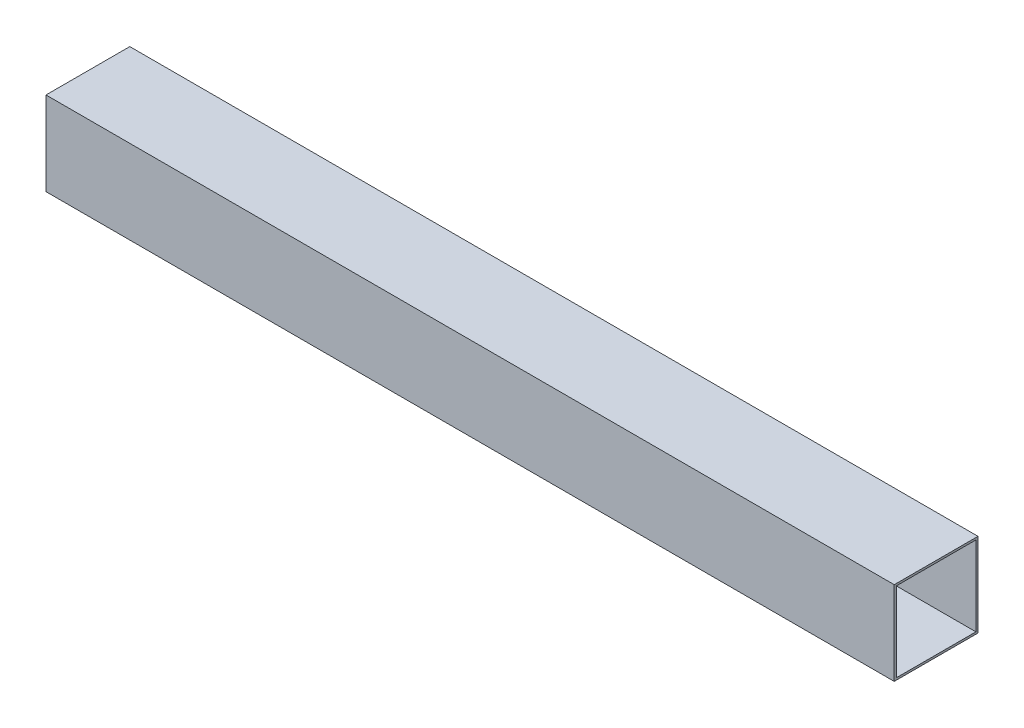
ISO-10303-21;
HEADER;
FILE_DESCRIPTION(('STEP AP214'),'2;1');
FILE_NAME('part.step','',(''),(''),'','','');
FILE_SCHEMA(('AUTOMOTIVE_DESIGN { 1 0 10303 214 1 1 1 1 }'));
ENDSEC;
DATA;
#1=APPLICATION_CONTEXT('core data for automotive mechanical design processes');
#2=APPLICATION_PROTOCOL_DEFINITION('international standard','automotive_design',2000,#1);
#3=PRODUCT_CONTEXT('',#1,'mechanical');
#4=PRODUCT('Part','Part','',(#3));
#5=PRODUCT_RELATED_PRODUCT_CATEGORY('part','',(#4));
#6=PRODUCT_DEFINITION_FORMATION('','',#4);
#7=PRODUCT_DEFINITION_CONTEXT('part definition',#1,'design');
#8=PRODUCT_DEFINITION('design','',#6,#7);
#9=PRODUCT_DEFINITION_SHAPE('','',#8);
#10=(LENGTH_UNIT() NAMED_UNIT(*) SI_UNIT(.MILLI.,.METRE.));
#11=(NAMED_UNIT(*) PLANE_ANGLE_UNIT() SI_UNIT($,.RADIAN.));
#12=(NAMED_UNIT(*) SI_UNIT($,.STERADIAN.) SOLID_ANGLE_UNIT());
#13=UNCERTAINTY_MEASURE_WITH_UNIT(LENGTH_MEASURE(1.E-05),#10,'distance_accuracy_value','');
#14=(GEOMETRIC_REPRESENTATION_CONTEXT(3) GLOBAL_UNCERTAINTY_ASSIGNED_CONTEXT((#13)) GLOBAL_UNIT_ASSIGNED_CONTEXT((#10,
#11,#12)) REPRESENTATION_CONTEXT('',''));
#15=CARTESIAN_POINT('',(0.,0.,0.));
#16=DIRECTION('',(0.,0.,1.));
#17=DIRECTION('',(1.,0.,0.));
#18=AXIS2_PLACEMENT_3D('',#15,#16,#17);
#19=CARTESIAN_POINT('',(405.,0.,0.));
#20=DIRECTION('',(1.,0.,0.));
#21=DIRECTION('',(0.,0.,-1.));
#22=AXIS2_PLACEMENT_3D('',#19,#20,#21);
#23=PLANE('',#22);
#24=DIRECTION('',(0.,-1.,0.));
#25=VECTOR('',#24,1.);
#26=CARTESIAN_POINT('',(405.,40.,40.));
#27=LINE('',#26,#25);
#28=CARTESIAN_POINT('',(405.,40.,40.));
#29=VERTEX_POINT('',#28);
#30=CARTESIAN_POINT('',(405.,-40.,40.));
#31=VERTEX_POINT('',#30);
#32=EDGE_CURVE('E136',#29,#31,#27,.T.);
#33=ORIENTED_EDGE('',*,*,#32,.T.);
#34=DIRECTION('',(0.,0.,-1.));
#35=VECTOR('',#34,1.);
#36=CARTESIAN_POINT('',(405.,-40.,40.));
#37=LINE('',#36,#35);
#38=CARTESIAN_POINT('',(405.,-40.,-40.));
#39=VERTEX_POINT('',#38);
#40=EDGE_CURVE('E139',#31,#39,#37,.T.);
#41=ORIENTED_EDGE('',*,*,#40,.T.);
#42=DIRECTION('',(0.,1.,0.));
#43=VECTOR('',#42,1.);
#44=CARTESIAN_POINT('',(405.,40.,-40.));
#45=LINE('',#44,#43);
#46=CARTESIAN_POINT('',(405.,40.,-40.));
#47=VERTEX_POINT('',#46);
#48=EDGE_CURVE('E142',#39,#47,#45,.T.);
#49=ORIENTED_EDGE('',*,*,#48,.T.);
#50=DIRECTION('',(0.,0.,1.));
#51=VECTOR('',#50,1.);
#52=CARTESIAN_POINT('',(405.,40.,40.));
#53=LINE('',#52,#51);
#54=EDGE_CURVE('E144',#47,#29,#53,.T.);
#55=ORIENTED_EDGE('',*,*,#54,.T.);
#56=EDGE_LOOP('',(#33,#41,#49,#55));
#57=FACE_BOUND('',#56,.T.);
#58=DIRECTION('',(0.,-1.,0.));
#59=VECTOR('',#58,1.);
#60=CARTESIAN_POINT('',(405.,38.,38.));
#61=LINE('',#60,#59);
#62=CARTESIAN_POINT('',(405.,38.,38.));
#63=VERTEX_POINT('',#62);
#64=CARTESIAN_POINT('',(405.,-38.,38.));
#65=VERTEX_POINT('',#64);
#66=EDGE_CURVE('E108',#63,#65,#61,.T.);
#67=ORIENTED_EDGE('',*,*,#66,.F.);
#68=DIRECTION('',(0.,0.,1.));
#69=VECTOR('',#68,1.);
#70=CARTESIAN_POINT('',(405.,38.,38.));
#71=LINE('',#70,#69);
#72=CARTESIAN_POINT('',(405.,38.,-38.));
#73=VERTEX_POINT('',#72);
#74=EDGE_CURVE('E100',#73,#63,#71,.T.);
#75=ORIENTED_EDGE('',*,*,#74,.F.);
#76=DIRECTION('',(0.,1.,0.));
#77=VECTOR('',#76,1.);
#78=CARTESIAN_POINT('',(405.,38.,-38.));
#79=LINE('',#78,#77);
#80=CARTESIAN_POINT('',(405.,-38.,-38.));
#81=VERTEX_POINT('',#80);
#82=EDGE_CURVE('E122',#81,#73,#79,.T.);
#83=ORIENTED_EDGE('',*,*,#82,.F.);
#84=DIRECTION('',(0.,0.,-1.));
#85=VECTOR('',#84,1.);
#86=CARTESIAN_POINT('',(405.,-38.,38.));
#87=LINE('',#86,#85);
#88=EDGE_CURVE('E120',#65,#81,#87,.T.);
#89=ORIENTED_EDGE('',*,*,#88,.F.);
#90=EDGE_LOOP('',(#67,#75,#83,#89));
#91=FACE_BOUND('',#90,.T.);
#92=ADVANCED_FACE('F35',(#57,#91),#23,.T.);
#93=CARTESIAN_POINT('',(-405.,0.,0.));
#94=DIRECTION('',(1.,0.,0.));
#95=DIRECTION('',(0.,0.,-1.));
#96=AXIS2_PLACEMENT_3D('',#93,#94,#95);
#97=PLANE('',#96);
#98=DIRECTION('',(0.,-1.,0.));
#99=VECTOR('',#98,1.);
#100=CARTESIAN_POINT('',(-405.,40.,40.));
#101=LINE('',#100,#99);
#102=CARTESIAN_POINT('',(-405.,40.,40.));
#103=VERTEX_POINT('',#102);
#104=CARTESIAN_POINT('',(-405.,-40.,40.));
#105=VERTEX_POINT('',#104);
#106=EDGE_CURVE('E116',#103,#105,#101,.T.);
#107=ORIENTED_EDGE('',*,*,#106,.F.);
#108=DIRECTION('',(0.,0.,1.));
#109=VECTOR('',#108,1.);
#110=CARTESIAN_POINT('',(-405.,40.,40.));
#111=LINE('',#110,#109);
#112=CARTESIAN_POINT('',(-405.,40.,-40.));
#113=VERTEX_POINT('',#112);
#114=EDGE_CURVE('E140',#113,#103,#111,.T.);
#115=ORIENTED_EDGE('',*,*,#114,.F.);
#116=DIRECTION('',(0.,1.,0.));
#117=VECTOR('',#116,1.);
#118=CARTESIAN_POINT('',(-405.,40.,-40.));
#119=LINE('',#118,#117);
#120=CARTESIAN_POINT('',(-405.,-40.,-40.));
#121=VERTEX_POINT('',#120);
#122=EDGE_CURVE('E151',#121,#113,#119,.T.);
#123=ORIENTED_EDGE('',*,*,#122,.F.);
#124=DIRECTION('',(0.,0.,-1.));
#125=VECTOR('',#124,1.);
#126=CARTESIAN_POINT('',(-405.,-40.,40.));
#127=LINE('',#126,#125);
#128=EDGE_CURVE('E149',#105,#121,#127,.T.);
#129=ORIENTED_EDGE('',*,*,#128,.F.);
#130=EDGE_LOOP('',(#107,#115,#123,#129));
#131=FACE_BOUND('',#130,.T.);
#132=DIRECTION('',(0.,0.,1.));
#133=VECTOR('',#132,1.);
#134=CARTESIAN_POINT('',(-405.,38.,38.));
#135=LINE('',#134,#133);
#136=CARTESIAN_POINT('',(-405.,38.,-38.));
#137=VERTEX_POINT('',#136);
#138=CARTESIAN_POINT('',(-405.,38.,38.));
#139=VERTEX_POINT('',#138);
#140=EDGE_CURVE('E58',#137,#139,#135,.T.);
#141=ORIENTED_EDGE('',*,*,#140,.T.);
#142=DIRECTION('',(0.,-1.,0.));
#143=VECTOR('',#142,1.);
#144=CARTESIAN_POINT('',(-405.,38.,38.));
#145=LINE('',#144,#143);
#146=CARTESIAN_POINT('',(-405.,-38.,38.));
#147=VERTEX_POINT('',#146);
#148=EDGE_CURVE('E115',#139,#147,#145,.T.);
#149=ORIENTED_EDGE('',*,*,#148,.T.);
#150=DIRECTION('',(0.,0.,-1.));
#151=VECTOR('',#150,1.);
#152=CARTESIAN_POINT('',(-405.,-38.,38.));
#153=LINE('',#152,#151);
#154=CARTESIAN_POINT('',(-405.,-38.,-38.));
#155=VERTEX_POINT('',#154);
#156=EDGE_CURVE('E128',#147,#155,#153,.T.);
#157=ORIENTED_EDGE('',*,*,#156,.T.);
#158=DIRECTION('',(0.,1.,0.));
#159=VECTOR('',#158,1.);
#160=CARTESIAN_POINT('',(-405.,38.,-38.));
#161=LINE('',#160,#159);
#162=EDGE_CURVE('E109',#155,#137,#161,.T.);
#163=ORIENTED_EDGE('',*,*,#162,.T.);
#164=EDGE_LOOP('',(#141,#149,#157,#163));
#165=FACE_BOUND('',#164,.T.);
#166=ADVANCED_FACE('F169',(#131,#165),#97,.F.);
#167=CARTESIAN_POINT('',(405.,40.,40.));
#168=DIRECTION('',(0.,0.,-1.));
#169=DIRECTION('',(-1.,0.,0.));
#170=AXIS2_PLACEMENT_3D('',#167,#168,#169);
#171=PLANE('',#170);
#172=ORIENTED_EDGE('',*,*,#106,.T.);
#173=DIRECTION('',(-1.,0.,0.));
#174=VECTOR('',#173,1.);
#175=CARTESIAN_POINT('',(405.,-40.,40.));
#176=LINE('',#175,#174);
#177=EDGE_CURVE('E11',#31,#105,#176,.T.);
#178=ORIENTED_EDGE('',*,*,#177,.F.);
#179=ORIENTED_EDGE('',*,*,#32,.F.);
#180=DIRECTION('',(-1.,0.,0.));
#181=VECTOR('',#180,1.);
#182=CARTESIAN_POINT('',(405.,40.,40.));
#183=LINE('',#182,#181);
#184=EDGE_CURVE('E146',#29,#103,#183,.T.);
#185=ORIENTED_EDGE('',*,*,#184,.T.);
#186=EDGE_LOOP('',(#172,#178,#179,#185));
#187=FACE_BOUND('',#186,.T.);
#188=ADVANCED_FACE('F37',(#187),#171,.F.);
#189=CARTESIAN_POINT('',(405.,-40.,40.));
#190=DIRECTION('',(0.,1.,0.));
#191=DIRECTION('',(0.,0.,1.));
#192=AXIS2_PLACEMENT_3D('',#189,#190,#191);
#193=PLANE('',#192);
#194=ORIENTED_EDGE('',*,*,#128,.T.);
#195=DIRECTION('',(-1.,0.,0.));
#196=VECTOR('',#195,1.);
#197=CARTESIAN_POINT('',(405.,-40.,-40.));
#198=LINE('',#197,#196);
#199=EDGE_CURVE('E43',#39,#121,#198,.T.);
#200=ORIENTED_EDGE('',*,*,#199,.F.);
#201=ORIENTED_EDGE('',*,*,#40,.F.);
#202=ORIENTED_EDGE('',*,*,#177,.T.);
#203=EDGE_LOOP('',(#194,#200,#201,#202));
#204=FACE_BOUND('',#203,.T.);
#205=ADVANCED_FACE('F179',(#204),#193,.F.);
#206=CARTESIAN_POINT('',(405.,40.,-40.));
#207=DIRECTION('',(0.,0.,1.));
#208=DIRECTION('',(1.,0.,0.));
#209=AXIS2_PLACEMENT_3D('',#206,#207,#208);
#210=PLANE('',#209);
#211=ORIENTED_EDGE('',*,*,#122,.T.);
#212=DIRECTION('',(-1.,0.,0.));
#213=VECTOR('',#212,1.);
#214=CARTESIAN_POINT('',(405.,40.,-40.));
#215=LINE('',#214,#213);
#216=EDGE_CURVE('E156',#47,#113,#215,.T.);
#217=ORIENTED_EDGE('',*,*,#216,.F.);
#218=ORIENTED_EDGE('',*,*,#48,.F.);
#219=ORIENTED_EDGE('',*,*,#199,.T.);
#220=EDGE_LOOP('',(#211,#217,#218,#219));
#221=FACE_BOUND('',#220,.T.);
#222=ADVANCED_FACE('F163',(#221),#210,.F.);
#223=CARTESIAN_POINT('',(405.,40.,40.));
#224=DIRECTION('',(0.,-1.,0.));
#225=DIRECTION('',(0.,0.,-1.));
#226=AXIS2_PLACEMENT_3D('',#223,#224,#225);
#227=PLANE('',#226);
#228=ORIENTED_EDGE('',*,*,#114,.T.);
#229=ORIENTED_EDGE('',*,*,#184,.F.);
#230=ORIENTED_EDGE('',*,*,#54,.F.);
#231=ORIENTED_EDGE('',*,*,#216,.T.);
#232=EDGE_LOOP('',(#228,#229,#230,#231));
#233=FACE_BOUND('',#232,.T.);
#234=ADVANCED_FACE('F173',(#233),#227,.F.);
#235=CARTESIAN_POINT('',(405.,38.,38.));
#236=DIRECTION('',(0.,-1.,0.));
#237=DIRECTION('',(0.,0.,-1.));
#238=AXIS2_PLACEMENT_3D('',#235,#236,#237);
#239=PLANE('',#238);
#240=ORIENTED_EDGE('',*,*,#140,.F.);
#241=DIRECTION('',(-1.,0.,0.));
#242=VECTOR('',#241,1.);
#243=CARTESIAN_POINT('',(405.,38.,-38.));
#244=LINE('',#243,#242);
#245=EDGE_CURVE('E104',#73,#137,#244,.T.);
#246=ORIENTED_EDGE('',*,*,#245,.F.);
#247=ORIENTED_EDGE('',*,*,#74,.T.);
#248=DIRECTION('',(-1.,0.,0.));
#249=VECTOR('',#248,1.);
#250=CARTESIAN_POINT('',(405.,38.,38.));
#251=LINE('',#250,#249);
#252=EDGE_CURVE('E103',#63,#139,#251,.T.);
#253=ORIENTED_EDGE('',*,*,#252,.T.);
#254=EDGE_LOOP('',(#240,#246,#247,#253));
#255=FACE_BOUND('',#254,.T.);
#256=ADVANCED_FACE('F102',(#255),#239,.T.);
#257=CARTESIAN_POINT('',(405.,38.,38.));
#258=DIRECTION('',(0.,0.,-1.));
#259=DIRECTION('',(0.,1.,0.));
#260=AXIS2_PLACEMENT_3D('',#257,#258,#259);
#261=PLANE('',#260);
#262=ORIENTED_EDGE('',*,*,#148,.F.);
#263=ORIENTED_EDGE('',*,*,#252,.F.);
#264=ORIENTED_EDGE('',*,*,#66,.T.);
#265=DIRECTION('',(-1.,0.,0.));
#266=VECTOR('',#265,1.);
#267=CARTESIAN_POINT('',(405.,-38.,38.));
#268=LINE('',#267,#266);
#269=EDGE_CURVE('E117',#65,#147,#268,.T.);
#270=ORIENTED_EDGE('',*,*,#269,.T.);
#271=EDGE_LOOP('',(#262,#263,#264,#270));
#272=FACE_BOUND('',#271,.T.);
#273=ADVANCED_FACE('F112',(#272),#261,.T.);
#274=CARTESIAN_POINT('',(405.,-38.,38.));
#275=DIRECTION('',(0.,1.,0.));
#276=DIRECTION('',(0.,0.,1.));
#277=AXIS2_PLACEMENT_3D('',#274,#275,#276);
#278=PLANE('',#277);
#279=ORIENTED_EDGE('',*,*,#156,.F.);
#280=ORIENTED_EDGE('',*,*,#269,.F.);
#281=ORIENTED_EDGE('',*,*,#88,.T.);
#282=DIRECTION('',(-1.,0.,0.));
#283=VECTOR('',#282,1.);
#284=CARTESIAN_POINT('',(405.,-38.,-38.));
#285=LINE('',#284,#283);
#286=EDGE_CURVE('E50',#81,#155,#285,.T.);
#287=ORIENTED_EDGE('',*,*,#286,.T.);
#288=EDGE_LOOP('',(#279,#280,#281,#287));
#289=FACE_BOUND('',#288,.T.);
#290=ADVANCED_FACE('F202',(#289),#278,.T.);
#291=CARTESIAN_POINT('',(405.,38.,-38.));
#292=DIRECTION('',(0.,0.,1.));
#293=DIRECTION('',(0.,-1.,0.));
#294=AXIS2_PLACEMENT_3D('',#291,#292,#293);
#295=PLANE('',#294);
#296=ORIENTED_EDGE('',*,*,#162,.F.);
#297=ORIENTED_EDGE('',*,*,#286,.F.);
#298=ORIENTED_EDGE('',*,*,#82,.T.);
#299=ORIENTED_EDGE('',*,*,#245,.T.);
#300=EDGE_LOOP('',(#296,#297,#298,#299));
#301=FACE_BOUND('',#300,.T.);
#302=ADVANCED_FACE('F206',(#301),#295,.T.);
#303=CLOSED_SHELL('',(#92,#166,#188,#205,#222,#234,#256,#273,#290,#302));
#304=MANIFOLD_SOLID_BREP('B2',#303);
#305=ADVANCED_BREP_SHAPE_REPRESENTATION('',(#18,#304),#14);
#306=SHAPE_DEFINITION_REPRESENTATION(#9,#305);
ENDSEC;
END-ISO-10303-21;
